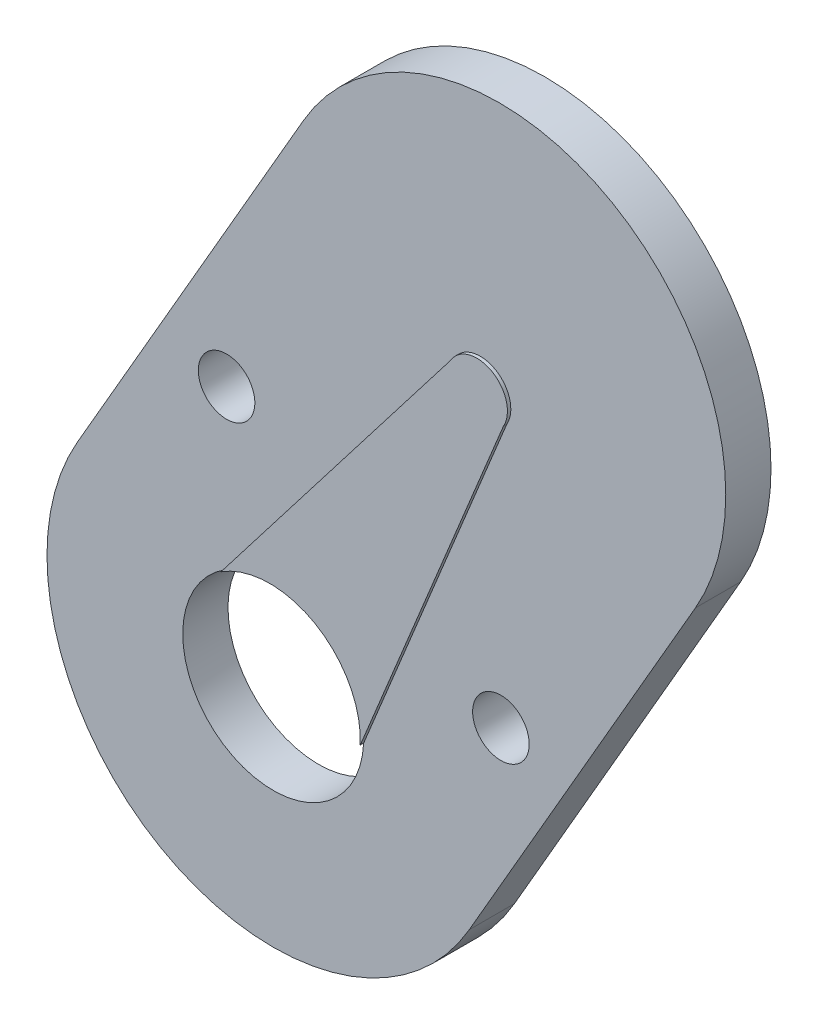
ISO-10303-21;
HEADER;
FILE_DESCRIPTION(('STEP AP214'),'2;1');
FILE_NAME('part.step','',(''),(''),'','','');
FILE_SCHEMA(('AUTOMOTIVE_DESIGN { 1 0 10303 214 1 1 1 1 }'));
ENDSEC;
DATA;
#1=APPLICATION_CONTEXT('core data for automotive mechanical design processes');
#2=APPLICATION_PROTOCOL_DEFINITION('international standard','automotive_design',2000,#1);
#3=PRODUCT_CONTEXT('',#1,'mechanical');
#4=PRODUCT('Part','Part','',(#3));
#5=PRODUCT_RELATED_PRODUCT_CATEGORY('part','',(#4));
#6=PRODUCT_DEFINITION_FORMATION('','',#4);
#7=PRODUCT_DEFINITION_CONTEXT('part definition',#1,'design');
#8=PRODUCT_DEFINITION('design','',#6,#7);
#9=PRODUCT_DEFINITION_SHAPE('','',#8);
#10=(LENGTH_UNIT() NAMED_UNIT(*) SI_UNIT(.MILLI.,.METRE.));
#11=(NAMED_UNIT(*) PLANE_ANGLE_UNIT() SI_UNIT($,.RADIAN.));
#12=(NAMED_UNIT(*) SI_UNIT($,.STERADIAN.) SOLID_ANGLE_UNIT());
#13=UNCERTAINTY_MEASURE_WITH_UNIT(LENGTH_MEASURE(1.E-05),#10,'distance_accuracy_value','');
#14=(GEOMETRIC_REPRESENTATION_CONTEXT(3) GLOBAL_UNCERTAINTY_ASSIGNED_CONTEXT((#13)) GLOBAL_UNIT_ASSIGNED_CONTEXT((#10,
#11,#12)) REPRESENTATION_CONTEXT('',''));
#15=CARTESIAN_POINT('',(0.,0.,0.));
#16=DIRECTION('',(0.,0.,1.));
#17=DIRECTION('',(1.,0.,0.));
#18=AXIS2_PLACEMENT_3D('',#15,#16,#17);
#19=CARTESIAN_POINT('',(3.29089653438087,-1.9,0.15));
#20=DIRECTION('',(-0.924714899355206,0.380660419416691,0.));
#21=DIRECTION('',(-0.380660419416692,-0.924714899355206,0.));
#22=AXIS2_PLACEMENT_3D('',#19,#20,#21);
#23=PLANE('',#22);
#24=DIRECTION('',(0.,0.,-1.));
#25=VECTOR('',#24,1.);
#26=CARTESIAN_POINT('',(3.99557121481817,-0.188177223160556,0.4));
#27=LINE('',#26,#25);
#28=CARTESIAN_POINT('',(3.99557121481817,-0.188177223160556,0.));
#29=VERTEX_POINT('',#28);
#30=CARTESIAN_POINT('',(3.99557121481817,-0.188177223160559,0.15));
#31=VERTEX_POINT('',#30);
#32=EDGE_CURVE('E57',#29,#31,#27,.F.);
#33=ORIENTED_EDGE('',*,*,#32,.F.);
#34=DIRECTION('',(0.380660419416691,0.924714899355206,0.));
#35=VECTOR('',#34,1.);
#36=CARTESIAN_POINT('',(3.29089653438087,-1.9,0.));
#37=LINE('',#36,#35);
#38=CARTESIAN_POINT('',(10.319134295109,15.1732648892552,0.));
#39=VERTEX_POINT('',#38);
#40=EDGE_CURVE('E129',#29,#39,#37,.T.);
#41=ORIENTED_EDGE('',*,*,#40,.T.);
#42=DIRECTION('',(0.,0.,-1.));
#43=VECTOR('',#42,1.);
#44=CARTESIAN_POINT('',(10.319134295109,15.1732648892552,0.15));
#45=LINE('',#44,#43);
#46=CARTESIAN_POINT('',(10.319134295109,15.1732648892552,0.15));
#47=VERTEX_POINT('',#46);
#48=EDGE_CURVE('E124',#47,#39,#45,.T.);
#49=ORIENTED_EDGE('',*,*,#48,.F.);
#50=DIRECTION('',(0.380660419416691,0.924714899355206,0.));
#51=VECTOR('',#50,1.);
#52=CARTESIAN_POINT('',(3.29089653438087,-1.9,0.15));
#53=LINE('',#52,#51);
#54=EDGE_CURVE('E125',#31,#47,#53,.T.);
#55=ORIENTED_EDGE('',*,*,#54,.F.);
#56=EDGE_LOOP('',(#33,#41,#49,#55));
#57=FACE_BOUND('',#56,.T.);
#58=ADVANCED_FACE('F39',(#57),#23,.F.);
#59=CARTESIAN_POINT('',(7.98086570489101,16.5232648892552,0.15));
#60=DIRECTION('',(0.792019043107697,-0.610496384391233,0.));
#61=DIRECTION('',(0.610496384391233,0.792019043107697,0.));
#62=AXIS2_PLACEMENT_3D('',#59,#60,#61);
#63=PLANE('',#62);
#64=DIRECTION('',(0.,0.,-1.));
#65=VECTOR('',#64,1.);
#66=CARTESIAN_POINT('',(-2.16075186307974,3.36617756308211,0.4));
#67=LINE('',#66,#65);
#68=CARTESIAN_POINT('',(-2.16075186307974,3.36617756308211,0.15));
#69=VERTEX_POINT('',#68);
#70=CARTESIAN_POINT('',(-2.16075186307974,3.36617756308211,0.));
#71=VERTEX_POINT('',#70);
#72=EDGE_CURVE('E110',#69,#71,#67,.T.);
#73=ORIENTED_EDGE('',*,*,#72,.F.);
#74=DIRECTION('',(-0.610496384391233,-0.792019043107697,0.));
#75=VECTOR('',#74,1.);
#76=CARTESIAN_POINT('',(7.98086570489101,16.5232648892552,0.15));
#77=LINE('',#76,#75);
#78=CARTESIAN_POINT('',(7.98086570489101,16.5232648892552,0.15));
#79=VERTEX_POINT('',#78);
#80=EDGE_CURVE('E114',#79,#69,#77,.T.);
#81=ORIENTED_EDGE('',*,*,#80,.F.);
#82=DIRECTION('',(0.,0.,-1.));
#83=VECTOR('',#82,1.);
#84=CARTESIAN_POINT('',(7.98086570489101,16.5232648892552,0.15));
#85=LINE('',#84,#83);
#86=CARTESIAN_POINT('',(7.98086570489101,16.5232648892552,0.));
#87=VERTEX_POINT('',#86);
#88=EDGE_CURVE('E122',#79,#87,#85,.T.);
#89=ORIENTED_EDGE('',*,*,#88,.T.);
#90=DIRECTION('',(-0.610496384391233,-0.792019043107697,0.));
#91=VECTOR('',#90,1.);
#92=CARTESIAN_POINT('',(7.98086570489101,16.5232648892552,0.));
#93=LINE('',#92,#91);
#94=EDGE_CURVE('E64',#87,#71,#93,.T.);
#95=ORIENTED_EDGE('',*,*,#94,.T.);
#96=EDGE_LOOP('',(#73,#81,#89,#95));
#97=FACE_BOUND('',#96,.T.);
#98=ADVANCED_FACE('F115',(#97),#63,.F.);
#99=CARTESIAN_POINT('',(0.,0.,0.));
#100=DIRECTION('',(0.,0.,1.));
#101=DIRECTION('',(1.,0.,0.));
#102=AXIS2_PLACEMENT_3D('',#99,#100,#101);
#103=PLANE('',#102);
#104=CARTESIAN_POINT('',(10.0621778264911,3.42820323027551,0.));
#105=DIRECTION('',(0.,0.,1.));
#106=DIRECTION('',(1.,0.,0.));
#107=AXIS2_PLACEMENT_3D('',#104,#105,#106);
#108=CIRCLE('',#107,1.25);
#109=CARTESIAN_POINT('',(11.3121778264911,3.42820323027551,0.));
#110=VERTEX_POINT('',#109);
#111=EDGE_CURVE('E113',#110,#110,#108,.F.);
#112=ORIENTED_EDGE('',*,*,#111,.T.);
#113=EDGE_LOOP('',(#112));
#114=FACE_BOUND('',#113,.T.);
#115=CARTESIAN_POINT('',(-2.06217782649107,10.4282032302755,0.));
#116=DIRECTION('',(0.,0.,1.));
#117=DIRECTION('',(1.,0.,0.));
#118=AXIS2_PLACEMENT_3D('',#115,#116,#117);
#119=CIRCLE('',#118,1.25);
#120=CARTESIAN_POINT('',(-0.812177826491071,10.4282032302755,0.));
#121=VERTEX_POINT('',#120);
#122=EDGE_CURVE('E167',#121,#121,#119,.F.);
#123=ORIENTED_EDGE('',*,*,#122,.T.);
#124=EDGE_LOOP('',(#123));
#125=FACE_BOUND('',#124,.T.);
#126=DIRECTION('',(0.5,0.866025403784439,0.));
#127=VECTOR('',#126,1.);
#128=CARTESIAN_POINT('',(8.66025403784439,-5.,0.));
#129=LINE('',#128,#127);
#130=CARTESIAN_POINT('',(8.66025403784439,-5.,0.));
#131=VERTEX_POINT('',#130);
#132=CARTESIAN_POINT('',(18.6602540378444,12.3205080756888,0.));
#133=VERTEX_POINT('',#132);
#134=EDGE_CURVE('E148',#131,#133,#129,.T.);
#135=ORIENTED_EDGE('',*,*,#134,.T.);
#136=CARTESIAN_POINT('',(10.,17.3205080756888,0.));
#137=DIRECTION('',(0.,0.,1.));
#138=DIRECTION('',(1.,0.,0.));
#139=AXIS2_PLACEMENT_3D('',#136,#137,#138);
#140=CIRCLE('',#139,10.);
#141=CARTESIAN_POINT('',(1.33974596215561,22.3205080756888,0.));
#142=VERTEX_POINT('',#141);
#143=EDGE_CURVE('E135',#133,#142,#140,.T.);
#144=ORIENTED_EDGE('',*,*,#143,.T.);
#145=DIRECTION('',(-0.5,-0.866025403784439,0.));
#146=VECTOR('',#145,1.);
#147=CARTESIAN_POINT('',(1.33974596215561,22.3205080756888,0.));
#148=LINE('',#147,#146);
#149=CARTESIAN_POINT('',(-8.66025403784439,5.,0.));
#150=VERTEX_POINT('',#149);
#151=EDGE_CURVE('E149',#142,#150,#148,.T.);
#152=ORIENTED_EDGE('',*,*,#151,.T.);
#153=CARTESIAN_POINT('',(0.,0.,0.));
#154=DIRECTION('',(0.,0.,1.));
#155=DIRECTION('',(1.,0.,0.));
#156=AXIS2_PLACEMENT_3D('',#153,#154,#155);
#157=CIRCLE('',#156,10.);
#158=EDGE_CURVE('E136',#150,#131,#157,.T.);
#159=ORIENTED_EDGE('',*,*,#158,.T.);
#160=EDGE_LOOP('',(#135,#144,#152,#159));
#161=FACE_BOUND('',#160,.T.);
#162=ORIENTED_EDGE('',*,*,#40,.F.);
#163=CARTESIAN_POINT('',(0.,0.,0.));
#164=DIRECTION('',(0.,0.,1.));
#165=DIRECTION('',(1.,0.,0.));
#166=AXIS2_PLACEMENT_3D('',#163,#164,#165);
#167=CIRCLE('',#166,4.);
#168=EDGE_CURVE('E178',#29,#71,#167,.F.);
#169=ORIENTED_EDGE('',*,*,#168,.T.);
#170=ORIENTED_EDGE('',*,*,#94,.F.);
#171=CARTESIAN_POINT('',(9.15,15.8482648892552,0.));
#172=DIRECTION('',(0.,0.,1.));
#173=DIRECTION('',(1.,0.,0.));
#174=AXIS2_PLACEMENT_3D('',#171,#172,#173);
#175=CIRCLE('',#174,1.35);
#176=EDGE_CURVE('E181',#39,#87,#175,.T.);
#177=ORIENTED_EDGE('',*,*,#176,.F.);
#178=EDGE_LOOP('',(#162,#169,#170,#177));
#179=FACE_BOUND('',#178,.T.);
#180=ADVANCED_FACE('F188',(#114,#125,#161,#179),#103,.T.);
#181=CARTESIAN_POINT('',(8.66025403784439,-5.,0.));
#182=DIRECTION('',(-0.866025403784439,0.5,0.));
#183=DIRECTION('',(-0.5,-0.866025403784439,0.));
#184=AXIS2_PLACEMENT_3D('',#181,#182,#183);
#185=PLANE('',#184);
#186=DIRECTION('',(0.5,0.866025403784439,0.));
#187=VECTOR('',#186,1.);
#188=CARTESIAN_POINT('',(8.66025403784439,-5.,-2.));
#189=LINE('',#188,#187);
#190=CARTESIAN_POINT('',(8.66025403784439,-5.,-2.));
#191=VERTEX_POINT('',#190);
#192=CARTESIAN_POINT('',(18.6602540378444,12.3205080756888,-2.));
#193=VERTEX_POINT('',#192);
#194=EDGE_CURVE('E141',#191,#193,#189,.T.);
#195=ORIENTED_EDGE('',*,*,#194,.T.);
#196=DIRECTION('',(0.,0.,-1.));
#197=VECTOR('',#196,1.);
#198=CARTESIAN_POINT('',(18.6602540378444,12.3205080756888,0.));
#199=LINE('',#198,#197);
#200=EDGE_CURVE('E161',#133,#193,#199,.T.);
#201=ORIENTED_EDGE('',*,*,#200,.F.);
#202=ORIENTED_EDGE('',*,*,#134,.F.);
#203=DIRECTION('',(0.,0.,-1.));
#204=VECTOR('',#203,1.);
#205=CARTESIAN_POINT('',(8.66025403784439,-5.,0.));
#206=LINE('',#205,#204);
#207=EDGE_CURVE('E48',#131,#191,#206,.T.);
#208=ORIENTED_EDGE('',*,*,#207,.T.);
#209=EDGE_LOOP('',(#195,#201,#202,#208));
#210=FACE_BOUND('',#209,.T.);
#211=ADVANCED_FACE('F41',(#210),#185,.F.);
#212=CARTESIAN_POINT('',(1.33974596215561,22.3205080756888,0.));
#213=DIRECTION('',(0.866025403784439,-0.5,0.));
#214=DIRECTION('',(0.5,0.866025403784439,0.));
#215=AXIS2_PLACEMENT_3D('',#212,#213,#214);
#216=PLANE('',#215);
#217=DIRECTION('',(-0.5,-0.866025403784439,0.));
#218=VECTOR('',#217,1.);
#219=CARTESIAN_POINT('',(1.33974596215561,22.3205080756888,-2.));
#220=LINE('',#219,#218);
#221=CARTESIAN_POINT('',(1.33974596215561,22.3205080756888,-2.));
#222=VERTEX_POINT('',#221);
#223=CARTESIAN_POINT('',(-8.66025403784439,5.,-2.));
#224=VERTEX_POINT('',#223);
#225=EDGE_CURVE('E147',#222,#224,#220,.T.);
#226=ORIENTED_EDGE('',*,*,#225,.T.);
#227=DIRECTION('',(0.,0.,-1.));
#228=VECTOR('',#227,1.);
#229=CARTESIAN_POINT('',(-8.66025403784439,5.,0.));
#230=LINE('',#229,#228);
#231=EDGE_CURVE('E155',#150,#224,#230,.T.);
#232=ORIENTED_EDGE('',*,*,#231,.F.);
#233=ORIENTED_EDGE('',*,*,#151,.F.);
#234=DIRECTION('',(0.,0.,-1.));
#235=VECTOR('',#234,1.);
#236=CARTESIAN_POINT('',(1.33974596215561,22.3205080756888,0.));
#237=LINE('',#236,#235);
#238=EDGE_CURVE('E158',#142,#222,#237,.T.);
#239=ORIENTED_EDGE('',*,*,#238,.T.);
#240=EDGE_LOOP('',(#226,#232,#233,#239));
#241=FACE_BOUND('',#240,.T.);
#242=ADVANCED_FACE('F213',(#241),#216,.F.);
#243=CARTESIAN_POINT('',(0.,0.,-2.));
#244=DIRECTION('',(0.,0.,1.));
#245=DIRECTION('',(1.,0.,0.));
#246=AXIS2_PLACEMENT_3D('',#243,#244,#245);
#247=PLANE('',#246);
#248=CARTESIAN_POINT('',(10.0621778264911,3.42820323027551,-2.));
#249=DIRECTION('',(0.,0.,1.));
#250=DIRECTION('',(1.,0.,0.));
#251=AXIS2_PLACEMENT_3D('',#248,#249,#250);
#252=CIRCLE('',#251,1.25);
#253=CARTESIAN_POINT('',(11.3121778264911,3.42820323027551,-2.));
#254=VERTEX_POINT('',#253);
#255=EDGE_CURVE('E43',#254,#254,#252,.F.);
#256=ORIENTED_EDGE('',*,*,#255,.F.);
#257=EDGE_LOOP('',(#256));
#258=FACE_BOUND('',#257,.T.);
#259=CARTESIAN_POINT('',(-2.06217782649107,10.4282032302755,-2.));
#260=DIRECTION('',(0.,0.,1.));
#261=DIRECTION('',(1.,0.,0.));
#262=AXIS2_PLACEMENT_3D('',#259,#260,#261);
#263=CIRCLE('',#262,1.25);
#264=CARTESIAN_POINT('',(-0.812177826491071,10.4282032302755,-2.));
#265=VERTEX_POINT('',#264);
#266=EDGE_CURVE('E163',#265,#265,#263,.F.);
#267=ORIENTED_EDGE('',*,*,#266,.F.);
#268=EDGE_LOOP('',(#267));
#269=FACE_BOUND('',#268,.T.);
#270=CARTESIAN_POINT('',(0.,0.,-2.));
#271=DIRECTION('',(0.,0.,1.));
#272=DIRECTION('',(1.,0.,0.));
#273=AXIS2_PLACEMENT_3D('',#270,#271,#272);
#274=CIRCLE('',#273,4.);
#275=CARTESIAN_POINT('',(4.,0.,-2.));
#276=VERTEX_POINT('',#275);
#277=EDGE_CURVE('E176',#276,#276,#274,.F.);
#278=ORIENTED_EDGE('',*,*,#277,.F.);
#279=EDGE_LOOP('',(#278));
#280=FACE_BOUND('',#279,.T.);
#281=ORIENTED_EDGE('',*,*,#225,.F.);
#282=CARTESIAN_POINT('',(10.,17.3205080756888,-2.));
#283=DIRECTION('',(0.,0.,1.));
#284=DIRECTION('',(1.,0.,0.));
#285=AXIS2_PLACEMENT_3D('',#282,#283,#284);
#286=CIRCLE('',#285,10.);
#287=EDGE_CURVE('E133',#193,#222,#286,.T.);
#288=ORIENTED_EDGE('',*,*,#287,.F.);
#289=ORIENTED_EDGE('',*,*,#194,.F.);
#290=CARTESIAN_POINT('',(0.,0.,-2.));
#291=DIRECTION('',(0.,0.,1.));
#292=DIRECTION('',(1.,0.,0.));
#293=AXIS2_PLACEMENT_3D('',#290,#291,#292);
#294=CIRCLE('',#293,10.);
#295=EDGE_CURVE('E138',#224,#191,#294,.T.);
#296=ORIENTED_EDGE('',*,*,#295,.F.);
#297=EDGE_LOOP('',(#281,#288,#289,#296));
#298=FACE_BOUND('',#297,.T.);
#299=ADVANCED_FACE('F210',(#258,#269,#280,#298),#247,.F.);
#300=CARTESIAN_POINT('',(0.,0.,0.));
#301=DIRECTION('',(0.,0.,-1.));
#302=DIRECTION('',(-1.,0.,0.));
#303=AXIS2_PLACEMENT_3D('',#300,#301,#302);
#304=CYLINDRICAL_SURFACE('',#303,10.);
#305=ORIENTED_EDGE('',*,*,#295,.T.);
#306=ORIENTED_EDGE('',*,*,#207,.F.);
#307=ORIENTED_EDGE('',*,*,#158,.F.);
#308=ORIENTED_EDGE('',*,*,#231,.T.);
#309=EDGE_LOOP('',(#305,#306,#307,#308));
#310=FACE_BOUND('',#309,.T.);
#311=ADVANCED_FACE('F201',(#310),#304,.T.);
#312=CARTESIAN_POINT('',(10.,17.3205080756888,0.));
#313=DIRECTION('',(0.,0.,-1.));
#314=DIRECTION('',(-1.,0.,0.));
#315=AXIS2_PLACEMENT_3D('',#312,#313,#314);
#316=CYLINDRICAL_SURFACE('',#315,10.);
#317=ORIENTED_EDGE('',*,*,#143,.F.);
#318=ORIENTED_EDGE('',*,*,#200,.T.);
#319=ORIENTED_EDGE('',*,*,#287,.T.);
#320=ORIENTED_EDGE('',*,*,#238,.F.);
#321=EDGE_LOOP('',(#317,#318,#319,#320));
#322=FACE_BOUND('',#321,.T.);
#323=ADVANCED_FACE('F199',(#322),#316,.T.);
#324=CARTESIAN_POINT('',(0.,0.,0.15));
#325=DIRECTION('',(0.,0.,1.));
#326=DIRECTION('',(1.,0.,0.));
#327=AXIS2_PLACEMENT_3D('',#324,#325,#326);
#328=PLANE('',#327);
#329=ORIENTED_EDGE('',*,*,#80,.T.);
#330=CARTESIAN_POINT('',(0.,0.,0.15));
#331=DIRECTION('',(0.,0.,1.));
#332=DIRECTION('',(1.,0.,0.));
#333=AXIS2_PLACEMENT_3D('',#330,#331,#332);
#334=CIRCLE('',#333,4.);
#335=EDGE_CURVE('E11',#69,#31,#334,.F.);
#336=ORIENTED_EDGE('',*,*,#335,.T.);
#337=ORIENTED_EDGE('',*,*,#54,.T.);
#338=CARTESIAN_POINT('',(9.15,15.8482648892552,0.15));
#339=DIRECTION('',(0.,0.,1.));
#340=DIRECTION('',(1.,0.,0.));
#341=AXIS2_PLACEMENT_3D('',#338,#339,#340);
#342=CIRCLE('',#341,1.35);
#343=EDGE_CURVE('E120',#47,#79,#342,.T.);
#344=ORIENTED_EDGE('',*,*,#343,.T.);
#345=EDGE_LOOP('',(#329,#336,#337,#344));
#346=FACE_BOUND('',#345,.T.);
#347=ADVANCED_FACE('F119',(#346),#328,.T.);
#348=CARTESIAN_POINT('',(9.15,15.8482648892552,0.15));
#349=DIRECTION('',(0.,0.,-1.));
#350=DIRECTION('',(-1.,0.,0.));
#351=AXIS2_PLACEMENT_3D('',#348,#349,#350);
#352=CYLINDRICAL_SURFACE('',#351,1.35);
#353=ORIENTED_EDGE('',*,*,#176,.T.);
#354=ORIENTED_EDGE('',*,*,#88,.F.);
#355=ORIENTED_EDGE('',*,*,#343,.F.);
#356=ORIENTED_EDGE('',*,*,#48,.T.);
#357=EDGE_LOOP('',(#353,#354,#355,#356));
#358=FACE_BOUND('',#357,.T.);
#359=ADVANCED_FACE('F186',(#358),#352,.T.);
#360=CARTESIAN_POINT('',(0.,0.,0.4));
#361=DIRECTION('',(0.,0.,-1.));
#362=DIRECTION('',(-1.,0.,0.));
#363=AXIS2_PLACEMENT_3D('',#360,#361,#362);
#364=CYLINDRICAL_SURFACE('',#363,4.);
#365=ORIENTED_EDGE('',*,*,#32,.T.);
#366=ORIENTED_EDGE('',*,*,#335,.F.);
#367=ORIENTED_EDGE('',*,*,#72,.T.);
#368=ORIENTED_EDGE('',*,*,#168,.F.);
#369=EDGE_LOOP('',(#365,#366,#367,#368));
#370=FACE_BOUND('',#369,.T.);
#371=ORIENTED_EDGE('',*,*,#277,.T.);
#372=EDGE_LOOP('',(#371));
#373=FACE_BOUND('',#372,.T.);
#374=ADVANCED_FACE('F104',(#370,#373),#364,.F.);
#375=CARTESIAN_POINT('',(-2.06217782649107,10.4282032302755,0.4));
#376=DIRECTION('',(0.,0.,-1.));
#377=DIRECTION('',(-1.,0.,0.));
#378=AXIS2_PLACEMENT_3D('',#375,#376,#377);
#379=CYLINDRICAL_SURFACE('',#378,1.25);
#380=ORIENTED_EDGE('',*,*,#122,.F.);
#381=EDGE_LOOP('',(#380));
#382=FACE_BOUND('',#381,.T.);
#383=ORIENTED_EDGE('',*,*,#266,.T.);
#384=EDGE_LOOP('',(#383));
#385=FACE_BOUND('',#384,.T.);
#386=ADVANCED_FACE('F290',(#382,#385),#379,.F.);
#387=CARTESIAN_POINT('',(10.0621778264911,3.42820323027551,0.4));
#388=DIRECTION('',(0.,0.,-1.));
#389=DIRECTION('',(-1.,0.,0.));
#390=AXIS2_PLACEMENT_3D('',#387,#388,#389);
#391=CYLINDRICAL_SURFACE('',#390,1.25);
#392=ORIENTED_EDGE('',*,*,#111,.F.);
#393=EDGE_LOOP('',(#392));
#394=FACE_BOUND('',#393,.T.);
#395=ORIENTED_EDGE('',*,*,#255,.T.);
#396=EDGE_LOOP('',(#395));
#397=FACE_BOUND('',#396,.T.);
#398=ADVANCED_FACE('F309',(#394,#397),#391,.F.);
#399=CLOSED_SHELL('',(#58,#98,#180,#211,#242,#299,#311,#323,#347,#359,#374,#386,#398));
#400=MANIFOLD_SOLID_BREP('B2',#399);
#401=ADVANCED_BREP_SHAPE_REPRESENTATION('',(#18,#400),#14);
#402=SHAPE_DEFINITION_REPRESENTATION(#9,#401);
ENDSEC;
END-ISO-10303-21;
